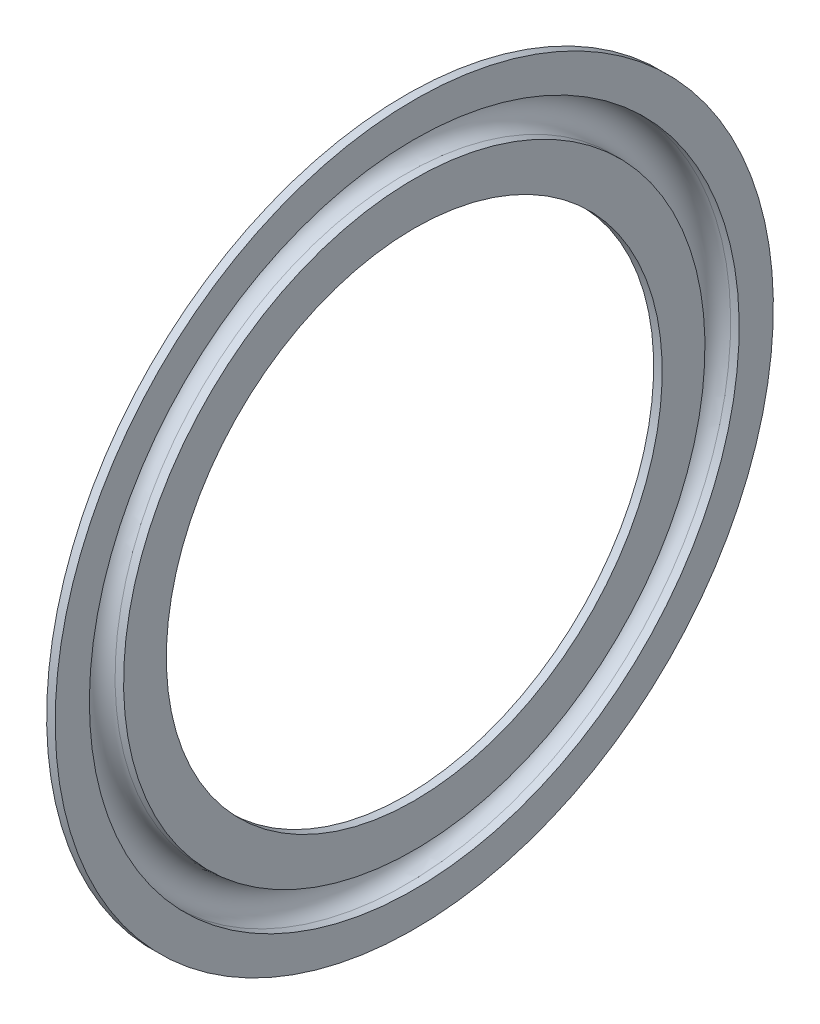
ISO-10303-21;
HEADER;
FILE_DESCRIPTION(('STEP AP214'),'2;1');
FILE_NAME('part.step','',(''),(''),'','','');
FILE_SCHEMA(('AUTOMOTIVE_DESIGN { 1 0 10303 214 1 1 1 1 }'));
ENDSEC;
DATA;
#1=APPLICATION_CONTEXT('core data for automotive mechanical design processes');
#2=APPLICATION_PROTOCOL_DEFINITION('international standard','automotive_design',2000,#1);
#3=PRODUCT_CONTEXT('',#1,'mechanical');
#4=PRODUCT('Part','Part','',(#3));
#5=PRODUCT_RELATED_PRODUCT_CATEGORY('part','',(#4));
#6=PRODUCT_DEFINITION_FORMATION('','',#4);
#7=PRODUCT_DEFINITION_CONTEXT('part definition',#1,'design');
#8=PRODUCT_DEFINITION('design','',#6,#7);
#9=PRODUCT_DEFINITION_SHAPE('','',#8);
#10=(LENGTH_UNIT() NAMED_UNIT(*) SI_UNIT(.MILLI.,.METRE.));
#11=(NAMED_UNIT(*) PLANE_ANGLE_UNIT() SI_UNIT($,.RADIAN.));
#12=(NAMED_UNIT(*) SI_UNIT($,.STERADIAN.) SOLID_ANGLE_UNIT());
#13=UNCERTAINTY_MEASURE_WITH_UNIT(LENGTH_MEASURE(1.E-05),#10,'distance_accuracy_value','');
#14=(GEOMETRIC_REPRESENTATION_CONTEXT(3) GLOBAL_UNCERTAINTY_ASSIGNED_CONTEXT((#13)) GLOBAL_UNIT_ASSIGNED_CONTEXT((#10,
#11,#12)) REPRESENTATION_CONTEXT('',''));
#15=CARTESIAN_POINT('',(0.,0.,0.));
#16=DIRECTION('',(0.,0.,1.));
#17=DIRECTION('',(1.,0.,0.));
#18=AXIS2_PLACEMENT_3D('',#15,#16,#17);
#19=CARTESIAN_POINT('',(8.85,42.9,120.969863647503));
#20=DIRECTION('',(1.,0.,0.));
#21=DIRECTION('',(0.,-0.948451293798745,-0.316922929576715));
#22=AXIS2_PLACEMENT_3D('',#19,#20,#21);
#23=TOROIDAL_SURFACE('',#22,1.8,0.1);
#24=CARTESIAN_POINT('',(8.85,42.9,120.969863647503));
#25=DIRECTION('',(1.,0.,0.));
#26=DIRECTION('',(0.,-0.948451293798745,-0.316922929576715));
#27=AXIS2_PLACEMENT_3D('',#24,#25,#26);
#28=CIRCLE('',#27,1.7);
#29=CARTESIAN_POINT('',(8.85,41.2876328005421,120.431094667223));
#30=VERTEX_POINT('',#29);
#31=EDGE_CURVE('E11',#30,#30,#28,.T.);
#32=ORIENTED_EDGE('',*,*,#31,.F.);
#33=EDGE_LOOP('',(#32));
#34=FACE_BOUND('',#33,.T.);
#35=CARTESIAN_POINT('',(8.85,42.9,120.969863647503));
#36=DIRECTION('',(1.,0.,0.));
#37=DIRECTION('',(0.,-0.948451293798745,-0.316922929576715));
#38=AXIS2_PLACEMENT_3D('',#35,#36,#37);
#39=CIRCLE('',#38,1.9);
#40=CARTESIAN_POINT('',(8.85,41.0979425417824,120.367710081307));
#41=VERTEX_POINT('',#40);
#42=EDGE_CURVE('E105',#41,#41,#39,.T.);
#43=ORIENTED_EDGE('',*,*,#42,.T.);
#44=EDGE_LOOP('',(#43));
#45=FACE_BOUND('',#44,.T.);
#46=ADVANCED_FACE('F39',(#34,#45),#23,.F.);
#47=CARTESIAN_POINT('',(7.45,42.9,120.969863647503));
#48=DIRECTION('',(1.,0.,0.));
#49=DIRECTION('',(0.,-0.948451293798745,-0.316922929576715));
#50=AXIS2_PLACEMENT_3D('',#47,#48,#49);
#51=CYLINDRICAL_SURFACE('',#50,1.7);
#52=CARTESIAN_POINT('',(8.9,42.9,120.969863647503));
#53=DIRECTION('',(1.,0.,0.));
#54=DIRECTION('',(0.,-0.948451293798745,-0.316922929576715));
#55=AXIS2_PLACEMENT_3D('',#52,#53,#54);
#56=CIRCLE('',#55,1.7);
#57=CARTESIAN_POINT('',(8.9,41.2876328005421,120.431094667223));
#58=VERTEX_POINT('',#57);
#59=EDGE_CURVE('E50',#58,#58,#56,.T.);
#60=ORIENTED_EDGE('',*,*,#59,.F.);
#61=EDGE_LOOP('',(#60));
#62=FACE_BOUND('',#61,.T.);
#63=ORIENTED_EDGE('',*,*,#31,.T.);
#64=EDGE_LOOP('',(#63));
#65=FACE_BOUND('',#64,.T.);
#66=ADVANCED_FACE('F141',(#62,#65),#51,.T.);
#67=CARTESIAN_POINT('',(8.9,44.5123671994579,121.508632627783));
#68=DIRECTION('',(-1.,0.,0.));
#69=DIRECTION('',(0.,-0.316922929576715,0.948451293798745));
#70=AXIS2_PLACEMENT_3D('',#67,#68,#69);
#71=PLANE('',#70);
#72=CARTESIAN_POINT('',(8.9,42.9,120.969863647503));
#73=DIRECTION('',(1.,0.,0.));
#74=DIRECTION('',(0.,-0.948451293798745,-0.316922929576715));
#75=AXIS2_PLACEMENT_3D('',#72,#73,#74);
#76=CIRCLE('',#75,1.45);
#77=CARTESIAN_POINT('',(8.9,41.5247456239918,120.510325399617));
#78=VERTEX_POINT('',#77);
#79=EDGE_CURVE('E115',#78,#78,#76,.T.);
#80=ORIENTED_EDGE('',*,*,#79,.F.);
#81=EDGE_LOOP('',(#80));
#82=FACE_BOUND('',#81,.T.);
#83=ORIENTED_EDGE('',*,*,#59,.T.);
#84=EDGE_LOOP('',(#83));
#85=FACE_BOUND('',#84,.T.);
#86=ADVANCED_FACE('F147',(#82,#85),#71,.F.);
#87=CARTESIAN_POINT('',(7.45,42.9,120.969863647503));
#88=DIRECTION('',(1.,0.,0.));
#89=DIRECTION('',(0.,-0.948451293798745,-0.316922929576715));
#90=AXIS2_PLACEMENT_3D('',#87,#88,#89);
#91=CYLINDRICAL_SURFACE('',#90,1.45);
#92=CARTESIAN_POINT('',(8.85,42.9,120.969863647503));
#93=DIRECTION('',(1.,0.,0.));
#94=DIRECTION('',(0.,-0.948451293798745,-0.316922929576715));
#95=AXIS2_PLACEMENT_3D('',#92,#93,#94);
#96=CIRCLE('',#95,1.45);
#97=CARTESIAN_POINT('',(8.85,41.5247456239918,120.510325399617));
#98=VERTEX_POINT('',#97);
#99=EDGE_CURVE('E117',#98,#98,#96,.T.);
#100=ORIENTED_EDGE('',*,*,#99,.F.);
#101=EDGE_LOOP('',(#100));
#102=FACE_BOUND('',#101,.T.);
#103=ORIENTED_EDGE('',*,*,#79,.T.);
#104=EDGE_LOOP('',(#103));
#105=FACE_BOUND('',#104,.T.);
#106=ADVANCED_FACE('F155',(#102,#105),#91,.F.);
#107=CARTESIAN_POINT('',(8.85,44.4649446347679,121.492786481305));
#108=DIRECTION('',(1.,0.,0.));
#109=DIRECTION('',(0.,-0.948451293798745,-0.316922929576715));
#110=AXIS2_PLACEMENT_3D('',#107,#108,#109);
#111=PLANE('',#110);
#112=ORIENTED_EDGE('',*,*,#99,.T.);
#113=EDGE_LOOP('',(#112));
#114=FACE_BOUND('',#113,.T.);
#115=CARTESIAN_POINT('',(8.85,42.9,120.969863647503));
#116=DIRECTION('',(1.,0.,0.));
#117=DIRECTION('',(0.,-0.948451293798745,-0.316922929576715));
#118=AXIS2_PLACEMENT_3D('',#115,#116,#117);
#119=CIRCLE('',#118,1.65);
#120=CARTESIAN_POINT('',(8.85,41.3350553652321,120.446940813701));
#121=VERTEX_POINT('',#120);
#122=EDGE_CURVE('E102',#121,#121,#119,.T.);
#123=ORIENTED_EDGE('',*,*,#122,.F.);
#124=EDGE_LOOP('',(#123));
#125=FACE_BOUND('',#124,.T.);
#126=ADVANCED_FACE('F152',(#114,#125),#111,.F.);
#127=CARTESIAN_POINT('',(8.85,42.9,120.969863647503));
#128=DIRECTION('',(1.,0.,0.));
#129=DIRECTION('',(0.,-0.948451293798745,-0.316922929576715));
#130=AXIS2_PLACEMENT_3D('',#127,#128,#129);
#131=TOROIDAL_SURFACE('',#130,1.8,0.15);
#132=CARTESIAN_POINT('',(8.85,42.9,120.969863647503));
#133=DIRECTION('',(1.,0.,0.));
#134=DIRECTION('',(0.,-0.948451293798745,-0.316922929576715));
#135=AXIS2_PLACEMENT_3D('',#132,#133,#134);
#136=CIRCLE('',#135,1.95);
#137=CARTESIAN_POINT('',(8.85,41.0505199770924,120.351863934828));
#138=VERTEX_POINT('',#137);
#139=EDGE_CURVE('E96',#138,#138,#136,.T.);
#140=ORIENTED_EDGE('',*,*,#139,.F.);
#141=EDGE_LOOP('',(#140));
#142=FACE_BOUND('',#141,.T.);
#143=ORIENTED_EDGE('',*,*,#122,.T.);
#144=EDGE_LOOP('',(#143));
#145=FACE_BOUND('',#144,.T.);
#146=ADVANCED_FACE('F41',(#142,#145),#131,.T.);
#147=CARTESIAN_POINT('',(8.85,44.7494800229076,121.587863360178));
#148=DIRECTION('',(1.,0.,0.));
#149=DIRECTION('',(0.,-0.948451293798745,-0.316922929576715));
#150=AXIS2_PLACEMENT_3D('',#147,#148,#149);
#151=PLANE('',#150);
#152=ORIENTED_EDGE('',*,*,#139,.T.);
#153=EDGE_LOOP('',(#152));
#154=FACE_BOUND('',#153,.T.);
#155=CARTESIAN_POINT('',(8.85,42.9,120.969863647503));
#156=DIRECTION('',(1.,0.,0.));
#157=DIRECTION('',(0.,-0.948451293798745,-0.316922929576715));
#158=AXIS2_PLACEMENT_3D('',#155,#156,#157);
#159=CIRCLE('',#158,2.1);
#160=CARTESIAN_POINT('',(8.85,40.9082522830226,120.304325495392));
#161=VERTEX_POINT('',#160);
#162=EDGE_CURVE('E43',#161,#161,#159,.T.);
#163=ORIENTED_EDGE('',*,*,#162,.F.);
#164=EDGE_LOOP('',(#163));
#165=FACE_BOUND('',#164,.T.);
#166=ADVANCED_FACE('F137',(#154,#165),#151,.F.);
#167=CARTESIAN_POINT('',(7.45,42.9,120.969863647503));
#168=DIRECTION('',(1.,0.,0.));
#169=DIRECTION('',(0.,-0.948451293798745,-0.316922929576715));
#170=AXIS2_PLACEMENT_3D('',#167,#168,#169);
#171=CYLINDRICAL_SURFACE('',#170,2.1);
#172=CARTESIAN_POINT('',(8.9,42.9,120.969863647503));
#173=DIRECTION('',(1.,0.,0.));
#174=DIRECTION('',(0.,-0.948451293798745,-0.316922929576715));
#175=AXIS2_PLACEMENT_3D('',#172,#173,#174);
#176=CIRCLE('',#175,2.1);
#177=CARTESIAN_POINT('',(8.9,40.9082522830226,120.304325495392));
#178=VERTEX_POINT('',#177);
#179=EDGE_CURVE('E97',#178,#178,#176,.T.);
#180=ORIENTED_EDGE('',*,*,#179,.F.);
#181=EDGE_LOOP('',(#180));
#182=FACE_BOUND('',#181,.T.);
#183=ORIENTED_EDGE('',*,*,#162,.T.);
#184=EDGE_LOOP('',(#183));
#185=FACE_BOUND('',#184,.T.);
#186=ADVANCED_FACE('F93',(#182,#185),#171,.T.);
#187=CARTESIAN_POINT('',(8.9,44.7020574582176,121.572017213699));
#188=DIRECTION('',(-1.,0.,0.));
#189=DIRECTION('',(0.,-0.316922929576715,0.948451293798745));
#190=AXIS2_PLACEMENT_3D('',#187,#188,#189);
#191=PLANE('',#190);
#192=CARTESIAN_POINT('',(8.9,42.9,120.969863647503));
#193=DIRECTION('',(1.,0.,0.));
#194=DIRECTION('',(0.,-0.948451293798745,-0.316922929576715));
#195=AXIS2_PLACEMENT_3D('',#192,#193,#194);
#196=CIRCLE('',#195,1.9);
#197=CARTESIAN_POINT('',(8.9,41.0979425417824,120.367710081307));
#198=VERTEX_POINT('',#197);
#199=EDGE_CURVE('E112',#198,#198,#196,.T.);
#200=ORIENTED_EDGE('',*,*,#199,.F.);
#201=EDGE_LOOP('',(#200));
#202=FACE_BOUND('',#201,.T.);
#203=ORIENTED_EDGE('',*,*,#179,.T.);
#204=EDGE_LOOP('',(#203));
#205=FACE_BOUND('',#204,.T.);
#206=ADVANCED_FACE('F129',(#202,#205),#191,.F.);
#207=CARTESIAN_POINT('',(7.45,42.9,120.969863647503));
#208=DIRECTION('',(1.,0.,0.));
#209=DIRECTION('',(0.,-0.948451293798745,-0.316922929576715));
#210=AXIS2_PLACEMENT_3D('',#207,#208,#209);
#211=CYLINDRICAL_SURFACE('',#210,1.9);
#212=ORIENTED_EDGE('',*,*,#42,.F.);
#213=EDGE_LOOP('',(#212));
#214=FACE_BOUND('',#213,.T.);
#215=ORIENTED_EDGE('',*,*,#199,.T.);
#216=EDGE_LOOP('',(#215));
#217=FACE_BOUND('',#216,.T.);
#218=ADVANCED_FACE('F127',(#214,#217),#211,.F.);
#219=CLOSED_SHELL('',(#46,#66,#86,#106,#126,#146,#166,#186,#206,#218));
#220=MANIFOLD_SOLID_BREP('B2',#219);
#221=ADVANCED_BREP_SHAPE_REPRESENTATION('',(#18,#220),#14);
#222=SHAPE_DEFINITION_REPRESENTATION(#9,#221);
ENDSEC;
END-ISO-10303-21;
